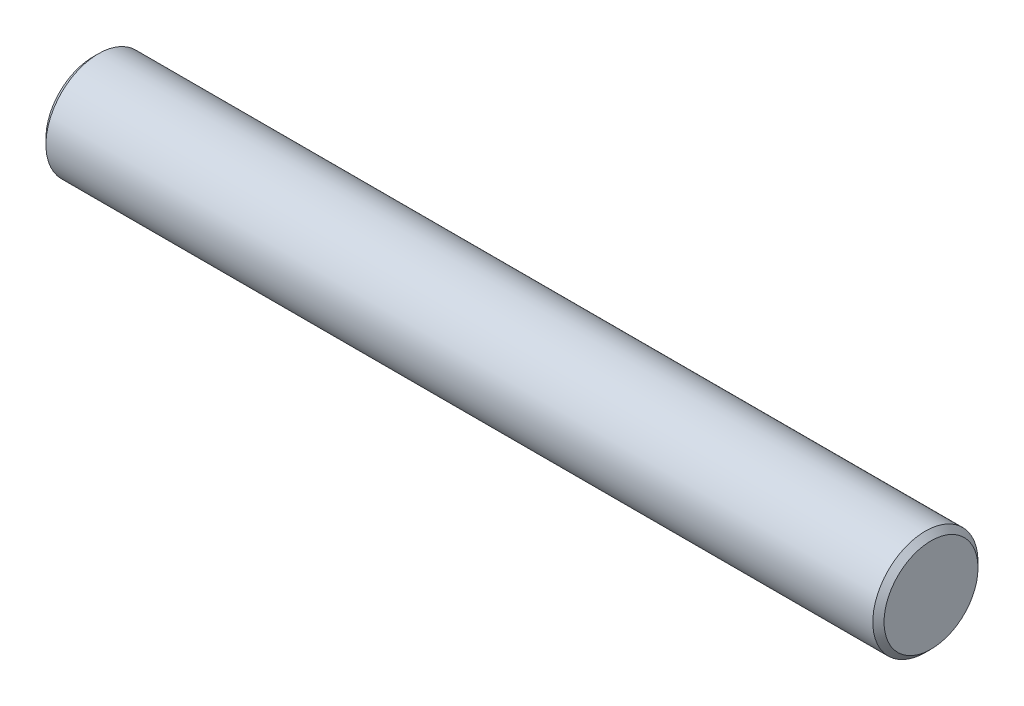
ISO-10303-21;
HEADER;
FILE_DESCRIPTION(('STEP AP214'),'2;1');
FILE_NAME('part.step','',(''),(''),'','','');
FILE_SCHEMA(('AUTOMOTIVE_DESIGN { 1 0 10303 214 1 1 1 1 }'));
ENDSEC;
DATA;
#1=APPLICATION_CONTEXT('core data for automotive mechanical design processes');
#2=APPLICATION_PROTOCOL_DEFINITION('international standard','automotive_design',2000,#1);
#3=PRODUCT_CONTEXT('',#1,'mechanical');
#4=PRODUCT('Part','Part','',(#3));
#5=PRODUCT_RELATED_PRODUCT_CATEGORY('part','',(#4));
#6=PRODUCT_DEFINITION_FORMATION('','',#4);
#7=PRODUCT_DEFINITION_CONTEXT('part definition',#1,'design');
#8=PRODUCT_DEFINITION('design','',#6,#7);
#9=PRODUCT_DEFINITION_SHAPE('','',#8);
#10=(LENGTH_UNIT() NAMED_UNIT(*) SI_UNIT(.MILLI.,.METRE.));
#11=(NAMED_UNIT(*) PLANE_ANGLE_UNIT() SI_UNIT($,.RADIAN.));
#12=(NAMED_UNIT(*) SI_UNIT($,.STERADIAN.) SOLID_ANGLE_UNIT());
#13=UNCERTAINTY_MEASURE_WITH_UNIT(LENGTH_MEASURE(1.E-05),#10,'distance_accuracy_value','');
#14=(GEOMETRIC_REPRESENTATION_CONTEXT(3) GLOBAL_UNCERTAINTY_ASSIGNED_CONTEXT((#13)) GLOBAL_UNIT_ASSIGNED_CONTEXT((#10,
#11,#12)) REPRESENTATION_CONTEXT('',''));
#15=CARTESIAN_POINT('',(0.,0.,0.));
#16=DIRECTION('',(0.,0.,1.));
#17=DIRECTION('',(1.,0.,0.));
#18=AXIS2_PLACEMENT_3D('',#15,#16,#17);
#19=CARTESIAN_POINT('',(37.846,0.,0.));
#20=DIRECTION('',(-1.,0.,0.));
#21=DIRECTION('',(0.,0.,1.));
#22=AXIS2_PLACEMENT_3D('',#19,#20,#21);
#23=CYLINDRICAL_SURFACE('',#22,2.3749);
#24=CARTESIAN_POINT('',(37.592,0.,0.));
#25=DIRECTION('',(1.,0.,0.));
#26=DIRECTION('',(0.,0.,-1.));
#27=AXIS2_PLACEMENT_3D('',#24,#25,#26);
#28=CIRCLE('',#27,2.3749);
#29=CARTESIAN_POINT('',(37.592,0.,-2.3749));
#30=VERTEX_POINT('',#29);
#31=EDGE_CURVE('E39',#30,#30,#28,.F.);
#32=ORIENTED_EDGE('',*,*,#31,.T.);
#33=EDGE_LOOP('',(#32));
#34=FACE_BOUND('',#33,.T.);
#35=CARTESIAN_POINT('',(0.253999999999997,0.,0.));
#36=DIRECTION('',(1.,0.,0.));
#37=DIRECTION('',(0.,0.,-1.));
#38=AXIS2_PLACEMENT_3D('',#35,#36,#37);
#39=CIRCLE('',#38,2.3749);
#40=CARTESIAN_POINT('',(0.253999999999997,0.,-2.3749));
#41=VERTEX_POINT('',#40);
#42=EDGE_CURVE('E43',#41,#41,#39,.T.);
#43=ORIENTED_EDGE('',*,*,#42,.T.);
#44=EDGE_LOOP('',(#43));
#45=FACE_BOUND('',#44,.T.);
#46=ADVANCED_FACE('F32',(#34,#45),#23,.T.);
#47=CARTESIAN_POINT('',(37.846,0.,0.));
#48=DIRECTION('',(1.,0.,0.));
#49=DIRECTION('',(0.,0.,-1.));
#50=AXIS2_PLACEMENT_3D('',#47,#48,#49);
#51=PLANE('',#50);
#52=CARTESIAN_POINT('',(37.846,0.,0.));
#53=DIRECTION('',(1.,0.,0.));
#54=DIRECTION('',(0.,0.,-1.));
#55=AXIS2_PLACEMENT_3D('',#52,#53,#54);
#56=CIRCLE('',#55,2.12090000000001);
#57=CARTESIAN_POINT('',(37.846,0.,-2.12090000000001));
#58=VERTEX_POINT('',#57);
#59=EDGE_CURVE('E47',#58,#58,#56,.T.);
#60=ORIENTED_EDGE('',*,*,#59,.T.);
#61=EDGE_LOOP('',(#60));
#62=FACE_BOUND('',#61,.T.);
#63=ADVANCED_FACE('F53',(#62),#51,.T.);
#64=CARTESIAN_POINT('',(0.,0.,0.));
#65=DIRECTION('',(1.,0.,0.));
#66=DIRECTION('',(0.,0.,-1.));
#67=AXIS2_PLACEMENT_3D('',#64,#65,#66);
#68=PLANE('',#67);
#69=CARTESIAN_POINT('',(0.,0.,0.));
#70=DIRECTION('',(1.,0.,0.));
#71=DIRECTION('',(0.,0.,-1.));
#72=AXIS2_PLACEMENT_3D('',#69,#70,#71);
#73=CIRCLE('',#72,2.1209);
#74=CARTESIAN_POINT('',(0.,0.,-2.1209));
#75=VERTEX_POINT('',#74);
#76=EDGE_CURVE('E10',#75,#75,#73,.F.);
#77=ORIENTED_EDGE('',*,*,#76,.T.);
#78=EDGE_LOOP('',(#77));
#79=FACE_BOUND('',#78,.T.);
#80=ADVANCED_FACE('F57',(#79),#68,.F.);
#81=CARTESIAN_POINT('',(37.846,0.,0.));
#82=DIRECTION('',(-1.,0.,0.));
#83=DIRECTION('',(0.,0.,1.));
#84=AXIS2_PLACEMENT_3D('',#81,#82,#83);
#85=CONICAL_SURFACE('',#84,2.12090000000001,0.785398163397448);
#86=ORIENTED_EDGE('',*,*,#31,.F.);
#87=EDGE_LOOP('',(#86));
#88=FACE_BOUND('',#87,.T.);
#89=ORIENTED_EDGE('',*,*,#59,.F.);
#90=EDGE_LOOP('',(#89));
#91=FACE_BOUND('',#90,.T.);
#92=ADVANCED_FACE('F55',(#88,#91),#85,.T.);
#93=CARTESIAN_POINT('',(0.253999999999997,0.,0.));
#94=DIRECTION('',(1.,0.,0.));
#95=DIRECTION('',(0.,0.,-1.));
#96=AXIS2_PLACEMENT_3D('',#93,#94,#95);
#97=CONICAL_SURFACE('',#96,2.3749,0.785398163397455);
#98=ORIENTED_EDGE('',*,*,#76,.F.);
#99=EDGE_LOOP('',(#98));
#100=FACE_BOUND('',#99,.T.);
#101=ORIENTED_EDGE('',*,*,#42,.F.);
#102=EDGE_LOOP('',(#101));
#103=FACE_BOUND('',#102,.T.);
#104=ADVANCED_FACE('F34',(#100,#103),#97,.T.);
#105=CLOSED_SHELL('',(#46,#63,#80,#92,#104));
#106=MANIFOLD_SOLID_BREP('B2',#105);
#107=ADVANCED_BREP_SHAPE_REPRESENTATION('',(#18,#106),#14);
#108=SHAPE_DEFINITION_REPRESENTATION(#9,#107);
ENDSEC;
END-ISO-10303-21;
